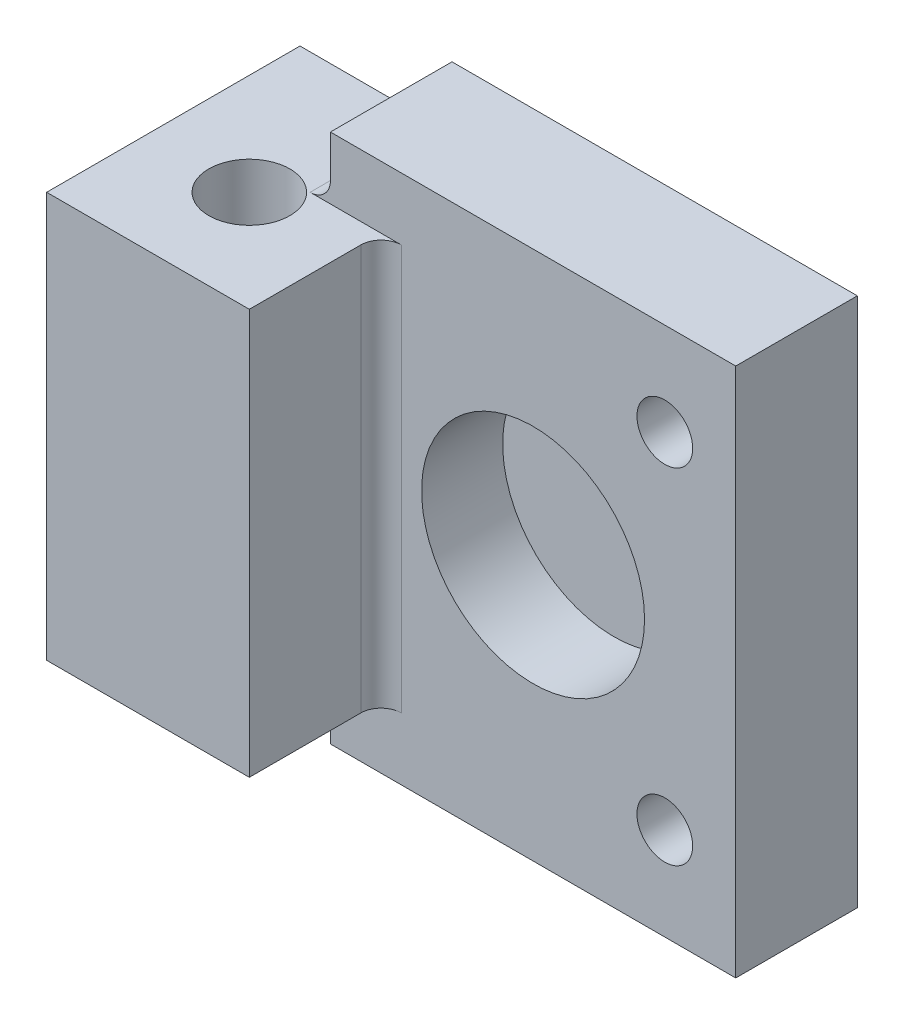
ISO-10303-21;
HEADER;
FILE_DESCRIPTION(('STEP AP214'),'2;1');
FILE_NAME('part.step','',(''),(''),'','','');
FILE_SCHEMA(('AUTOMOTIVE_DESIGN { 1 0 10303 214 1 1 1 1 }'));
ENDSEC;
DATA;
#1=APPLICATION_CONTEXT('core data for automotive mechanical design processes');
#2=APPLICATION_PROTOCOL_DEFINITION('international standard','automotive_design',2000,#1);
#3=PRODUCT_CONTEXT('',#1,'mechanical');
#4=PRODUCT('Part','Part','',(#3));
#5=PRODUCT_RELATED_PRODUCT_CATEGORY('part','',(#4));
#6=PRODUCT_DEFINITION_FORMATION('','',#4);
#7=PRODUCT_DEFINITION_CONTEXT('part definition',#1,'design');
#8=PRODUCT_DEFINITION('design','',#6,#7);
#9=PRODUCT_DEFINITION_SHAPE('','',#8);
#10=(LENGTH_UNIT() NAMED_UNIT(*) SI_UNIT(.MILLI.,.METRE.));
#11=(NAMED_UNIT(*) PLANE_ANGLE_UNIT() SI_UNIT($,.RADIAN.));
#12=(NAMED_UNIT(*) SI_UNIT($,.STERADIAN.) SOLID_ANGLE_UNIT());
#13=UNCERTAINTY_MEASURE_WITH_UNIT(LENGTH_MEASURE(1.E-05),#10,'distance_accuracy_value','');
#14=(GEOMETRIC_REPRESENTATION_CONTEXT(3) GLOBAL_UNCERTAINTY_ASSIGNED_CONTEXT((#13)) GLOBAL_UNIT_ASSIGNED_CONTEXT((#10,
#11,#12)) REPRESENTATION_CONTEXT('',''));
#15=CARTESIAN_POINT('',(0.,0.,0.));
#16=DIRECTION('',(0.,0.,1.));
#17=DIRECTION('',(1.,0.,0.));
#18=AXIS2_PLACEMENT_3D('',#15,#16,#17);
#19=CARTESIAN_POINT('',(0.,0.,12.));
#20=DIRECTION('',(0.,0.,-1.));
#21=DIRECTION('',(-1.,0.,0.));
#22=AXIS2_PLACEMENT_3D('',#19,#20,#21);
#23=PLANE('',#22);
#24=CARTESIAN_POINT('',(13.,-16.9975,12.));
#25=DIRECTION('',(0.,0.,1.));
#26=DIRECTION('',(1.,0.,0.));
#27=AXIS2_PLACEMENT_3D('',#24,#25,#26);
#28=CIRCLE('',#27,2.75);
#29=CARTESIAN_POINT('',(15.75,-16.9975,12.));
#30=VERTEX_POINT('',#29);
#31=EDGE_CURVE('E168',#30,#30,#28,.T.);
#32=ORIENTED_EDGE('',*,*,#31,.F.);
#33=EDGE_LOOP('',(#32));
#34=FACE_BOUND('',#33,.T.);
#35=CARTESIAN_POINT('',(13.,16.9975,12.));
#36=DIRECTION('',(0.,0.,1.));
#37=DIRECTION('',(1.,0.,0.));
#38=AXIS2_PLACEMENT_3D('',#35,#36,#37);
#39=CIRCLE('',#38,2.75);
#40=CARTESIAN_POINT('',(15.75,16.9975,12.));
#41=VERTEX_POINT('',#40);
#42=EDGE_CURVE('E174',#41,#41,#39,.T.);
#43=ORIENTED_EDGE('',*,*,#42,.F.);
#44=EDGE_LOOP('',(#43));
#45=FACE_BOUND('',#44,.T.);
#46=CARTESIAN_POINT('',(0.,0.,12.));
#47=DIRECTION('',(0.,0.,1.));
#48=DIRECTION('',(1.,0.,0.));
#49=AXIS2_PLACEMENT_3D('',#46,#47,#48);
#50=CIRCLE('',#49,11.);
#51=CARTESIAN_POINT('',(11.,0.,12.));
#52=VERTEX_POINT('',#51);
#53=EDGE_CURVE('E161',#52,#52,#50,.T.);
#54=ORIENTED_EDGE('',*,*,#53,.F.);
#55=EDGE_LOOP('',(#54));
#56=FACE_BOUND('',#55,.T.);
#57=DIRECTION('',(-1.,0.,0.));
#58=VECTOR('',#57,1.);
#59=CARTESIAN_POINT('',(0.,20.,12.));
#60=LINE('',#59,#58);
#61=CARTESIAN_POINT('',(-13.,20.,12.));
#62=VERTEX_POINT('',#61);
#63=CARTESIAN_POINT('',(-22.,20.,12.));
#64=VERTEX_POINT('',#63);
#65=EDGE_CURVE('E49',#62,#64,#60,.T.);
#66=ORIENTED_EDGE('',*,*,#65,.F.);
#67=DIRECTION('',(0.,1.,0.));
#68=VECTOR('',#67,1.);
#69=CARTESIAN_POINT('',(-13.,-20.,12.));
#70=LINE('',#69,#68);
#71=CARTESIAN_POINT('',(-13.,-20.,12.));
#72=VERTEX_POINT('',#71);
#73=EDGE_CURVE('E230',#62,#72,#70,.F.);
#74=ORIENTED_EDGE('',*,*,#73,.T.);
#75=DIRECTION('',(1.,0.,0.));
#76=VECTOR('',#75,1.);
#77=CARTESIAN_POINT('',(0.,-20.,12.));
#78=LINE('',#77,#76);
#79=CARTESIAN_POINT('',(-22.,-20.,12.));
#80=VERTEX_POINT('',#79);
#81=EDGE_CURVE('E56',#80,#72,#78,.T.);
#82=ORIENTED_EDGE('',*,*,#81,.F.);
#83=CARTESIAN_POINT('',(-22.,-22.,12.));
#84=DIRECTION('',(0.,0.,-1.));
#85=DIRECTION('',(-1.,0.,0.));
#86=AXIS2_PLACEMENT_3D('',#83,#84,#85);
#87=CIRCLE('',#86,2.);
#88=CARTESIAN_POINT('',(-20.,-22.,12.));
#89=VERTEX_POINT('',#88);
#90=EDGE_CURVE('E224',#80,#89,#87,.T.);
#91=ORIENTED_EDGE('',*,*,#90,.T.);
#92=DIRECTION('',(0.,-1.,0.));
#93=VECTOR('',#92,1.);
#94=CARTESIAN_POINT('',(-20.,26.15,12.));
#95=LINE('',#94,#93);
#96=CARTESIAN_POINT('',(-20.,-26.15,12.));
#97=VERTEX_POINT('',#96);
#98=EDGE_CURVE('E184',#89,#97,#95,.T.);
#99=ORIENTED_EDGE('',*,*,#98,.T.);
#100=DIRECTION('',(1.,0.,0.));
#101=VECTOR('',#100,1.);
#102=CARTESIAN_POINT('',(20.,-26.15,12.));
#103=LINE('',#102,#101);
#104=CARTESIAN_POINT('',(20.,-26.15,12.));
#105=VERTEX_POINT('',#104);
#106=EDGE_CURVE('E183',#97,#105,#103,.T.);
#107=ORIENTED_EDGE('',*,*,#106,.T.);
#108=DIRECTION('',(0.,1.,0.));
#109=VECTOR('',#108,1.);
#110=CARTESIAN_POINT('',(20.,26.15,12.));
#111=LINE('',#110,#109);
#112=CARTESIAN_POINT('',(20.,26.15,12.));
#113=VERTEX_POINT('',#112);
#114=EDGE_CURVE('E186',#105,#113,#111,.T.);
#115=ORIENTED_EDGE('',*,*,#114,.T.);
#116=DIRECTION('',(-1.,0.,0.));
#117=VECTOR('',#116,1.);
#118=CARTESIAN_POINT('',(20.,26.15,12.));
#119=LINE('',#118,#117);
#120=CARTESIAN_POINT('',(-20.,26.15,12.));
#121=VERTEX_POINT('',#120);
#122=EDGE_CURVE('E188',#113,#121,#119,.T.);
#123=ORIENTED_EDGE('',*,*,#122,.T.);
#124=CARTESIAN_POINT('',(-20.,22.,12.));
#125=VERTEX_POINT('',#124);
#126=EDGE_CURVE('E180',#121,#125,#95,.T.);
#127=ORIENTED_EDGE('',*,*,#126,.T.);
#128=CARTESIAN_POINT('',(-22.,22.,12.));
#129=DIRECTION('',(0.,0.,-1.));
#130=DIRECTION('',(-1.,0.,0.));
#131=AXIS2_PLACEMENT_3D('',#128,#129,#130);
#132=CIRCLE('',#131,2.);
#133=EDGE_CURVE('E222',#125,#64,#132,.T.);
#134=ORIENTED_EDGE('',*,*,#133,.T.);
#135=EDGE_LOOP('',(#66,#74,#82,#91,#99,#107,#115,#123,#127,#134));
#136=FACE_BOUND('',#135,.T.);
#137=ADVANCED_FACE('F34',(#34,#45,#56,#136),#23,.F.);
#138=CARTESIAN_POINT('',(-20.,26.15,12.));
#139=DIRECTION('',(1.,0.,0.));
#140=DIRECTION('',(0.,1.,0.));
#141=AXIS2_PLACEMENT_3D('',#138,#139,#140);
#142=PLANE('',#141);
#143=ORIENTED_EDGE('',*,*,#98,.F.);
#144=DIRECTION('',(0.,0.,1.));
#145=VECTOR('',#144,1.);
#146=CARTESIAN_POINT('',(-20.,-22.,0.));
#147=LINE('',#146,#145);
#148=CARTESIAN_POINT('',(-20.,-22.,0.));
#149=VERTEX_POINT('',#148);
#150=EDGE_CURVE('E218',#89,#149,#147,.F.);
#151=ORIENTED_EDGE('',*,*,#150,.T.);
#152=DIRECTION('',(0.,-1.,0.));
#153=VECTOR('',#152,1.);
#154=CARTESIAN_POINT('',(-20.,26.15,0.));
#155=LINE('',#154,#153);
#156=CARTESIAN_POINT('',(-20.,-26.15,0.));
#157=VERTEX_POINT('',#156);
#158=EDGE_CURVE('E177',#149,#157,#155,.T.);
#159=ORIENTED_EDGE('',*,*,#158,.T.);
#160=DIRECTION('',(0.,0.,-1.));
#161=VECTOR('',#160,1.);
#162=CARTESIAN_POINT('',(-20.,-26.15,12.));
#163=LINE('',#162,#161);
#164=EDGE_CURVE('E208',#97,#157,#163,.T.);
#165=ORIENTED_EDGE('',*,*,#164,.F.);
#166=EDGE_LOOP('',(#143,#151,#159,#165));
#167=FACE_BOUND('',#166,.T.);
#168=ADVANCED_FACE('F246',(#167),#142,.F.);
#169=CARTESIAN_POINT('',(-20.,26.15,0.));
#170=VERTEX_POINT('',#169);
#171=CARTESIAN_POINT('',(-20.,22.,0.));
#172=VERTEX_POINT('',#171);
#173=EDGE_CURVE('E191',#170,#172,#155,.T.);
#174=ORIENTED_EDGE('',*,*,#173,.T.);
#175=DIRECTION('',(0.,0.,-1.));
#176=VECTOR('',#175,1.);
#177=CARTESIAN_POINT('',(-20.,22.,12.));
#178=LINE('',#177,#176);
#179=EDGE_CURVE('E214',#172,#125,#178,.F.);
#180=ORIENTED_EDGE('',*,*,#179,.T.);
#181=ORIENTED_EDGE('',*,*,#126,.F.);
#182=DIRECTION('',(0.,0.,-1.));
#183=VECTOR('',#182,1.);
#184=CARTESIAN_POINT('',(-20.,26.15,12.));
#185=LINE('',#184,#183);
#186=EDGE_CURVE('E190',#121,#170,#185,.T.);
#187=ORIENTED_EDGE('',*,*,#186,.T.);
#188=EDGE_LOOP('',(#174,#180,#181,#187));
#189=FACE_BOUND('',#188,.T.);
#190=ADVANCED_FACE('F266',(#189),#142,.F.);
#191=CARTESIAN_POINT('',(0.,0.,0.));
#192=DIRECTION('',(0.,0.,-1.));
#193=DIRECTION('',(-1.,0.,0.));
#194=AXIS2_PLACEMENT_3D('',#191,#192,#193);
#195=PLANE('',#194);
#196=DIRECTION('',(1.,0.,0.));
#197=VECTOR('',#196,1.);
#198=CARTESIAN_POINT('',(-35.,20.,0.));
#199=LINE('',#198,#197);
#200=CARTESIAN_POINT('',(-35.,20.,0.));
#201=VERTEX_POINT('',#200);
#202=CARTESIAN_POINT('',(-22.,20.,0.));
#203=VERTEX_POINT('',#202);
#204=EDGE_CURVE('E272',#201,#203,#199,.T.);
#205=ORIENTED_EDGE('',*,*,#204,.T.);
#206=CARTESIAN_POINT('',(-22.,22.,0.));
#207=DIRECTION('',(0.,0.,-1.));
#208=DIRECTION('',(-1.,0.,0.));
#209=AXIS2_PLACEMENT_3D('',#206,#207,#208);
#210=CIRCLE('',#209,2.);
#211=EDGE_CURVE('E220',#203,#172,#210,.F.);
#212=ORIENTED_EDGE('',*,*,#211,.T.);
#213=ORIENTED_EDGE('',*,*,#173,.F.);
#214=DIRECTION('',(-1.,0.,0.));
#215=VECTOR('',#214,1.);
#216=CARTESIAN_POINT('',(20.,26.15,0.));
#217=LINE('',#216,#215);
#218=CARTESIAN_POINT('',(20.,26.15,0.));
#219=VERTEX_POINT('',#218);
#220=EDGE_CURVE('E198',#219,#170,#217,.T.);
#221=ORIENTED_EDGE('',*,*,#220,.F.);
#222=DIRECTION('',(0.,1.,0.));
#223=VECTOR('',#222,1.);
#224=CARTESIAN_POINT('',(20.,26.15,0.));
#225=LINE('',#224,#223);
#226=CARTESIAN_POINT('',(20.,-26.15,0.));
#227=VERTEX_POINT('',#226);
#228=EDGE_CURVE('E196',#227,#219,#225,.T.);
#229=ORIENTED_EDGE('',*,*,#228,.F.);
#230=DIRECTION('',(1.,0.,0.));
#231=VECTOR('',#230,1.);
#232=CARTESIAN_POINT('',(20.,-26.15,0.));
#233=LINE('',#232,#231);
#234=EDGE_CURVE('E194',#157,#227,#233,.T.);
#235=ORIENTED_EDGE('',*,*,#234,.F.);
#236=ORIENTED_EDGE('',*,*,#158,.F.);
#237=CARTESIAN_POINT('',(-22.,-22.,0.));
#238=DIRECTION('',(0.,0.,-1.));
#239=DIRECTION('',(-1.,0.,0.));
#240=AXIS2_PLACEMENT_3D('',#237,#238,#239);
#241=CIRCLE('',#240,2.);
#242=CARTESIAN_POINT('',(-22.,-20.,0.));
#243=VERTEX_POINT('',#242);
#244=EDGE_CURVE('E153',#149,#243,#241,.F.);
#245=ORIENTED_EDGE('',*,*,#244,.T.);
#246=DIRECTION('',(1.,0.,0.));
#247=VECTOR('',#246,1.);
#248=CARTESIAN_POINT('',(-35.,-20.,0.));
#249=LINE('',#248,#247);
#250=CARTESIAN_POINT('',(-35.,-20.,0.));
#251=VERTEX_POINT('',#250);
#252=EDGE_CURVE('E131',#251,#243,#249,.T.);
#253=ORIENTED_EDGE('',*,*,#252,.F.);
#254=DIRECTION('',(0.,-1.,0.));
#255=VECTOR('',#254,1.);
#256=CARTESIAN_POINT('',(-35.,20.,0.));
#257=LINE('',#256,#255);
#258=EDGE_CURVE('E138',#201,#251,#257,.T.);
#259=ORIENTED_EDGE('',*,*,#258,.F.);
#260=EDGE_LOOP('',(#205,#212,#213,#221,#229,#235,#236,#245,#253,#259));
#261=FACE_BOUND('',#260,.T.);
#262=CARTESIAN_POINT('',(13.,16.9975,0.));
#263=DIRECTION('',(0.,0.,1.));
#264=DIRECTION('',(1.,0.,0.));
#265=AXIS2_PLACEMENT_3D('',#262,#263,#264);
#266=CIRCLE('',#265,2.75);
#267=CARTESIAN_POINT('',(15.75,16.9975,0.));
#268=VERTEX_POINT('',#267);
#269=EDGE_CURVE('E171',#268,#268,#266,.T.);
#270=ORIENTED_EDGE('',*,*,#269,.T.);
#271=EDGE_LOOP('',(#270));
#272=FACE_BOUND('',#271,.T.);
#273=CARTESIAN_POINT('',(13.,-16.9975,0.));
#274=DIRECTION('',(0.,0.,1.));
#275=DIRECTION('',(1.,0.,0.));
#276=AXIS2_PLACEMENT_3D('',#273,#274,#275);
#277=CIRCLE('',#276,2.75);
#278=CARTESIAN_POINT('',(15.75,-16.9975,0.));
#279=VERTEX_POINT('',#278);
#280=EDGE_CURVE('E165',#279,#279,#277,.T.);
#281=ORIENTED_EDGE('',*,*,#280,.T.);
#282=EDGE_LOOP('',(#281));
#283=FACE_BOUND('',#282,.T.);
#284=ADVANCED_FACE('F149',(#261,#272,#283),#195,.T.);
#285=CARTESIAN_POINT('',(20.,-26.15,12.));
#286=DIRECTION('',(0.,1.,0.));
#287=DIRECTION('',(0.,0.,1.));
#288=AXIS2_PLACEMENT_3D('',#285,#286,#287);
#289=PLANE('',#288);
#290=ORIENTED_EDGE('',*,*,#234,.T.);
#291=DIRECTION('',(0.,0.,-1.));
#292=VECTOR('',#291,1.);
#293=CARTESIAN_POINT('',(20.,-26.15,12.));
#294=LINE('',#293,#292);
#295=EDGE_CURVE('E205',#105,#227,#294,.T.);
#296=ORIENTED_EDGE('',*,*,#295,.F.);
#297=ORIENTED_EDGE('',*,*,#106,.F.);
#298=ORIENTED_EDGE('',*,*,#164,.T.);
#299=EDGE_LOOP('',(#290,#296,#297,#298));
#300=FACE_BOUND('',#299,.T.);
#301=ADVANCED_FACE('F254',(#300),#289,.F.);
#302=CARTESIAN_POINT('',(20.,26.15,12.));
#303=DIRECTION('',(-1.,0.,0.));
#304=DIRECTION('',(0.,-1.,0.));
#305=AXIS2_PLACEMENT_3D('',#302,#303,#304);
#306=PLANE('',#305);
#307=ORIENTED_EDGE('',*,*,#228,.T.);
#308=DIRECTION('',(0.,0.,-1.));
#309=VECTOR('',#308,1.);
#310=CARTESIAN_POINT('',(20.,26.15,12.));
#311=LINE('',#310,#309);
#312=EDGE_CURVE('E202',#113,#219,#311,.T.);
#313=ORIENTED_EDGE('',*,*,#312,.F.);
#314=ORIENTED_EDGE('',*,*,#114,.F.);
#315=ORIENTED_EDGE('',*,*,#295,.T.);
#316=EDGE_LOOP('',(#307,#313,#314,#315));
#317=FACE_BOUND('',#316,.T.);
#318=ADVANCED_FACE('F260',(#317),#306,.F.);
#319=CARTESIAN_POINT('',(20.,26.15,12.));
#320=DIRECTION('',(0.,-1.,0.));
#321=DIRECTION('',(1.,0.,0.));
#322=AXIS2_PLACEMENT_3D('',#319,#320,#321);
#323=PLANE('',#322);
#324=ORIENTED_EDGE('',*,*,#220,.T.);
#325=ORIENTED_EDGE('',*,*,#186,.F.);
#326=ORIENTED_EDGE('',*,*,#122,.F.);
#327=ORIENTED_EDGE('',*,*,#312,.T.);
#328=EDGE_LOOP('',(#324,#325,#326,#327));
#329=FACE_BOUND('',#328,.T.);
#330=ADVANCED_FACE('F262',(#329),#323,.F.);
#331=CARTESIAN_POINT('',(13.,16.9975,12.));
#332=DIRECTION('',(0.,0.,-1.));
#333=DIRECTION('',(-1.,0.,0.));
#334=AXIS2_PLACEMENT_3D('',#331,#332,#333);
#335=CYLINDRICAL_SURFACE('',#334,2.75);
#336=ORIENTED_EDGE('',*,*,#42,.T.);
#337=EDGE_LOOP('',(#336));
#338=FACE_BOUND('',#337,.T.);
#339=ORIENTED_EDGE('',*,*,#269,.F.);
#340=EDGE_LOOP('',(#339));
#341=FACE_BOUND('',#340,.T.);
#342=ADVANCED_FACE('F320',(#338,#341),#335,.F.);
#343=CARTESIAN_POINT('',(13.,-16.9975,12.));
#344=DIRECTION('',(0.,0.,-1.));
#345=DIRECTION('',(-1.,0.,0.));
#346=AXIS2_PLACEMENT_3D('',#343,#344,#345);
#347=CYLINDRICAL_SURFACE('',#346,2.75);
#348=ORIENTED_EDGE('',*,*,#31,.T.);
#349=EDGE_LOOP('',(#348));
#350=FACE_BOUND('',#349,.T.);
#351=ORIENTED_EDGE('',*,*,#280,.F.);
#352=EDGE_LOOP('',(#351));
#353=FACE_BOUND('',#352,.T.);
#354=ADVANCED_FACE('F437',(#350,#353),#347,.F.);
#355=CARTESIAN_POINT('',(0.,0.,4.));
#356=DIRECTION('',(0.,0.,1.));
#357=DIRECTION('',(1.,0.,0.));
#358=AXIS2_PLACEMENT_3D('',#355,#356,#357);
#359=CYLINDRICAL_SURFACE('',#358,11.);
#360=CARTESIAN_POINT('',(0.,0.,4.));
#361=DIRECTION('',(0.,0.,1.));
#362=DIRECTION('',(1.,0.,0.));
#363=AXIS2_PLACEMENT_3D('',#360,#361,#362);
#364=CIRCLE('',#363,11.);
#365=CARTESIAN_POINT('',(11.,0.,4.));
#366=VERTEX_POINT('',#365);
#367=EDGE_CURVE('E162',#366,#366,#364,.T.);
#368=ORIENTED_EDGE('',*,*,#367,.F.);
#369=EDGE_LOOP('',(#368));
#370=FACE_BOUND('',#369,.T.);
#371=ORIENTED_EDGE('',*,*,#53,.T.);
#372=EDGE_LOOP('',(#371));
#373=FACE_BOUND('',#372,.T.);
#374=ADVANCED_FACE('F427',(#370,#373),#359,.F.);
#375=CARTESIAN_POINT('',(0.,0.,4.));
#376=DIRECTION('',(0.,0.,1.));
#377=DIRECTION('',(1.,0.,0.));
#378=AXIS2_PLACEMENT_3D('',#375,#376,#377);
#379=PLANE('',#378);
#380=ORIENTED_EDGE('',*,*,#367,.T.);
#381=EDGE_LOOP('',(#380));
#382=FACE_BOUND('',#381,.T.);
#383=ADVANCED_FACE('F357',(#382),#379,.T.);
#384=CARTESIAN_POINT('',(-15.,0.,0.));
#385=DIRECTION('',(-1.,0.,0.));
#386=DIRECTION('',(0.,-1.,0.));
#387=AXIS2_PLACEMENT_3D('',#384,#385,#386);
#388=PLANE('',#387);
#389=DIRECTION('',(0.,0.,1.));
#390=VECTOR('',#389,1.);
#391=CARTESIAN_POINT('',(-15.,-20.,0.));
#392=LINE('',#391,#390);
#393=CARTESIAN_POINT('',(-15.,-20.,14.));
#394=VERTEX_POINT('',#393);
#395=CARTESIAN_POINT('',(-15.,-20.,25.));
#396=VERTEX_POINT('',#395);
#397=EDGE_CURVE('E279',#394,#396,#392,.T.);
#398=ORIENTED_EDGE('',*,*,#397,.F.);
#399=DIRECTION('',(0.,1.,0.));
#400=VECTOR('',#399,1.);
#401=CARTESIAN_POINT('',(-15.,20.,14.));
#402=LINE('',#401,#400);
#403=CARTESIAN_POINT('',(-15.,20.,14.));
#404=VERTEX_POINT('',#403);
#405=EDGE_CURVE('E227',#394,#404,#402,.T.);
#406=ORIENTED_EDGE('',*,*,#405,.T.);
#407=DIRECTION('',(0.,0.,-1.));
#408=VECTOR('',#407,1.);
#409=CARTESIAN_POINT('',(-15.,20.,0.));
#410=LINE('',#409,#408);
#411=CARTESIAN_POINT('',(-15.,20.,25.));
#412=VERTEX_POINT('',#411);
#413=EDGE_CURVE('E147',#412,#404,#410,.T.);
#414=ORIENTED_EDGE('',*,*,#413,.F.);
#415=DIRECTION('',(0.,1.,0.));
#416=VECTOR('',#415,1.);
#417=CARTESIAN_POINT('',(-15.,20.,25.));
#418=LINE('',#417,#416);
#419=EDGE_CURVE('E277',#396,#412,#418,.T.);
#420=ORIENTED_EDGE('',*,*,#419,.F.);
#421=EDGE_LOOP('',(#398,#406,#414,#420));
#422=FACE_BOUND('',#421,.T.);
#423=ADVANCED_FACE('F306',(#422),#388,.F.);
#424=CARTESIAN_POINT('',(-35.,-20.,0.));
#425=DIRECTION('',(0.,1.,0.));
#426=DIRECTION('',(-1.,0.,0.));
#427=AXIS2_PLACEMENT_3D('',#424,#425,#426);
#428=PLANE('',#427);
#429=ORIENTED_EDGE('',*,*,#252,.T.);
#430=DIRECTION('',(0.,0.,1.));
#431=VECTOR('',#430,1.);
#432=CARTESIAN_POINT('',(-22.,-20.,12.));
#433=LINE('',#432,#431);
#434=EDGE_CURVE('E216',#243,#80,#433,.T.);
#435=ORIENTED_EDGE('',*,*,#434,.T.);
#436=ORIENTED_EDGE('',*,*,#81,.T.);
#437=CARTESIAN_POINT('',(-13.,-20.,14.));
#438=DIRECTION('',(0.,1.,0.));
#439=DIRECTION('',(-1.,0.,0.));
#440=AXIS2_PLACEMENT_3D('',#437,#438,#439);
#441=CIRCLE('',#440,2.);
#442=EDGE_CURVE('E11',#72,#394,#441,.T.);
#443=ORIENTED_EDGE('',*,*,#442,.T.);
#444=ORIENTED_EDGE('',*,*,#397,.T.);
#445=DIRECTION('',(1.,0.,0.));
#446=VECTOR('',#445,1.);
#447=CARTESIAN_POINT('',(-35.,-20.,25.));
#448=LINE('',#447,#446);
#449=CARTESIAN_POINT('',(-35.,-20.,25.));
#450=VERTEX_POINT('',#449);
#451=EDGE_CURVE('E134',#450,#396,#448,.T.);
#452=ORIENTED_EDGE('',*,*,#451,.F.);
#453=DIRECTION('',(0.,0.,1.));
#454=VECTOR('',#453,1.);
#455=CARTESIAN_POINT('',(-35.,-20.,0.));
#456=LINE('',#455,#454);
#457=EDGE_CURVE('E127',#251,#450,#456,.T.);
#458=ORIENTED_EDGE('',*,*,#457,.F.);
#459=EDGE_LOOP('',(#429,#435,#436,#443,#444,#452,#458));
#460=FACE_BOUND('',#459,.T.);
#461=ADVANCED_FACE('F129',(#460),#428,.F.);
#462=CARTESIAN_POINT('',(-35.,20.,0.));
#463=DIRECTION('',(0.,-1.,0.));
#464=DIRECTION('',(1.,0.,0.));
#465=AXIS2_PLACEMENT_3D('',#462,#463,#464);
#466=PLANE('',#465);
#467=CARTESIAN_POINT('',(-25.,20.,15.));
#468=DIRECTION('',(0.,1.,0.));
#469=DIRECTION('',(-1.,0.,0.));
#470=AXIS2_PLACEMENT_3D('',#467,#468,#469);
#471=CIRCLE('',#470,4.);
#472=CARTESIAN_POINT('',(-29.,20.,15.));
#473=VERTEX_POINT('',#472);
#474=EDGE_CURVE('E283',#473,#473,#471,.T.);
#475=ORIENTED_EDGE('',*,*,#474,.F.);
#476=EDGE_LOOP('',(#475));
#477=FACE_BOUND('',#476,.T.);
#478=ORIENTED_EDGE('',*,*,#65,.T.);
#479=DIRECTION('',(0.,0.,-1.));
#480=VECTOR('',#479,1.);
#481=CARTESIAN_POINT('',(-22.,20.,0.));
#482=LINE('',#481,#480);
#483=EDGE_CURVE('E211',#64,#203,#482,.T.);
#484=ORIENTED_EDGE('',*,*,#483,.T.);
#485=ORIENTED_EDGE('',*,*,#204,.F.);
#486=DIRECTION('',(0.,0.,-1.));
#487=VECTOR('',#486,1.);
#488=CARTESIAN_POINT('',(-35.,20.,0.));
#489=LINE('',#488,#487);
#490=CARTESIAN_POINT('',(-35.,20.,25.));
#491=VERTEX_POINT('',#490);
#492=EDGE_CURVE('E143',#491,#201,#489,.T.);
#493=ORIENTED_EDGE('',*,*,#492,.F.);
#494=DIRECTION('',(1.,0.,0.));
#495=VECTOR('',#494,1.);
#496=CARTESIAN_POINT('',(-35.,20.,25.));
#497=LINE('',#496,#495);
#498=EDGE_CURVE('E156',#491,#412,#497,.T.);
#499=ORIENTED_EDGE('',*,*,#498,.T.);
#500=ORIENTED_EDGE('',*,*,#413,.T.);
#501=CARTESIAN_POINT('',(-13.,20.,14.));
#502=DIRECTION('',(0.,-1.,0.));
#503=DIRECTION('',(1.,0.,0.));
#504=AXIS2_PLACEMENT_3D('',#501,#502,#503);
#505=CIRCLE('',#504,2.);
#506=EDGE_CURVE('E42',#404,#62,#505,.T.);
#507=ORIENTED_EDGE('',*,*,#506,.T.);
#508=EDGE_LOOP('',(#478,#484,#485,#493,#499,#500,#507));
#509=FACE_BOUND('',#508,.T.);
#510=ADVANCED_FACE('F234',(#477,#509),#466,.F.);
#511=CARTESIAN_POINT('',(-35.,20.,25.));
#512=DIRECTION('',(0.,0.,-1.));
#513=DIRECTION('',(-1.,0.,0.));
#514=AXIS2_PLACEMENT_3D('',#511,#512,#513);
#515=PLANE('',#514);
#516=ORIENTED_EDGE('',*,*,#419,.T.);
#517=ORIENTED_EDGE('',*,*,#498,.F.);
#518=DIRECTION('',(0.,1.,0.));
#519=VECTOR('',#518,1.);
#520=CARTESIAN_POINT('',(-35.,20.,25.));
#521=LINE('',#520,#519);
#522=EDGE_CURVE('E137',#450,#491,#521,.T.);
#523=ORIENTED_EDGE('',*,*,#522,.F.);
#524=ORIENTED_EDGE('',*,*,#451,.T.);
#525=EDGE_LOOP('',(#516,#517,#523,#524));
#526=FACE_BOUND('',#525,.T.);
#527=ADVANCED_FACE('F298',(#526),#515,.F.);
#528=CARTESIAN_POINT('',(-35.,0.,0.));
#529=DIRECTION('',(-1.,0.,0.));
#530=DIRECTION('',(0.,-1.,0.));
#531=AXIS2_PLACEMENT_3D('',#528,#529,#530);
#532=PLANE('',#531);
#533=ORIENTED_EDGE('',*,*,#258,.T.);
#534=ORIENTED_EDGE('',*,*,#457,.T.);
#535=ORIENTED_EDGE('',*,*,#522,.T.);
#536=ORIENTED_EDGE('',*,*,#492,.T.);
#537=EDGE_LOOP('',(#533,#534,#535,#536));
#538=FACE_BOUND('',#537,.T.);
#539=ADVANCED_FACE('F141',(#538),#532,.T.);
#540=CARTESIAN_POINT('',(-25.,-15.,15.));
#541=DIRECTION('',(0.,1.,0.));
#542=DIRECTION('',(-1.,0.,0.));
#543=AXIS2_PLACEMENT_3D('',#540,#541,#542);
#544=CYLINDRICAL_SURFACE('',#543,4.);
#545=CARTESIAN_POINT('',(-25.,-15.,15.));
#546=DIRECTION('',(0.,1.,0.));
#547=DIRECTION('',(-1.,0.,0.));
#548=AXIS2_PLACEMENT_3D('',#545,#546,#547);
#549=CIRCLE('',#548,4.);
#550=CARTESIAN_POINT('',(-29.,-15.,15.));
#551=VERTEX_POINT('',#550);
#552=EDGE_CURVE('E280',#551,#551,#549,.T.);
#553=ORIENTED_EDGE('',*,*,#552,.F.);
#554=EDGE_LOOP('',(#553));
#555=FACE_BOUND('',#554,.T.);
#556=ORIENTED_EDGE('',*,*,#474,.T.);
#557=EDGE_LOOP('',(#556));
#558=FACE_BOUND('',#557,.T.);
#559=ADVANCED_FACE('F291',(#555,#558),#544,.F.);
#560=CARTESIAN_POINT('',(-25.,-15.,15.));
#561=DIRECTION('',(0.,1.,0.));
#562=DIRECTION('',(-1.,0.,0.));
#563=AXIS2_PLACEMENT_3D('',#560,#561,#562);
#564=PLANE('',#563);
#565=ORIENTED_EDGE('',*,*,#552,.T.);
#566=EDGE_LOOP('',(#565));
#567=FACE_BOUND('',#566,.T.);
#568=ADVANCED_FACE('F289',(#567),#564,.T.);
#569=CARTESIAN_POINT('',(-22.,22.,0.));
#570=DIRECTION('',(0.,0.,1.));
#571=DIRECTION('',(1.,0.,0.));
#572=AXIS2_PLACEMENT_3D('',#569,#570,#571);
#573=CYLINDRICAL_SURFACE('',#572,2.);
#574=ORIENTED_EDGE('',*,*,#133,.F.);
#575=ORIENTED_EDGE('',*,*,#179,.F.);
#576=ORIENTED_EDGE('',*,*,#211,.F.);
#577=ORIENTED_EDGE('',*,*,#483,.F.);
#578=EDGE_LOOP('',(#574,#575,#576,#577));
#579=FACE_BOUND('',#578,.T.);
#580=ADVANCED_FACE('F271',(#579),#573,.F.);
#581=CARTESIAN_POINT('',(-22.,-22.,0.));
#582=DIRECTION('',(0.,0.,-1.));
#583=DIRECTION('',(-1.,0.,0.));
#584=AXIS2_PLACEMENT_3D('',#581,#582,#583);
#585=CYLINDRICAL_SURFACE('',#584,2.);
#586=ORIENTED_EDGE('',*,*,#244,.F.);
#587=ORIENTED_EDGE('',*,*,#150,.F.);
#588=ORIENTED_EDGE('',*,*,#90,.F.);
#589=ORIENTED_EDGE('',*,*,#434,.F.);
#590=EDGE_LOOP('',(#586,#587,#588,#589));
#591=FACE_BOUND('',#590,.T.);
#592=ADVANCED_FACE('F244',(#591),#585,.F.);
#593=CARTESIAN_POINT('',(-13.,0.,14.));
#594=DIRECTION('',(0.,-1.,0.));
#595=DIRECTION('',(1.,0.,0.));
#596=AXIS2_PLACEMENT_3D('',#593,#594,#595);
#597=CYLINDRICAL_SURFACE('',#596,2.);
#598=ORIENTED_EDGE('',*,*,#442,.F.);
#599=ORIENTED_EDGE('',*,*,#73,.F.);
#600=ORIENTED_EDGE('',*,*,#506,.F.);
#601=ORIENTED_EDGE('',*,*,#405,.F.);
#602=EDGE_LOOP('',(#598,#599,#600,#601));
#603=FACE_BOUND('',#602,.T.);
#604=ADVANCED_FACE('F36',(#603),#597,.F.);
#605=CLOSED_SHELL('',(#137,#168,#190,#284,#301,#318,#330,#342,#354,#374,#383,#423,#461,#510,
#527,#539,#559,#568,#580,#592,#604));
#606=MANIFOLD_SOLID_BREP('B2',#605);
#607=ADVANCED_BREP_SHAPE_REPRESENTATION('',(#18,#606),#14);
#608=SHAPE_DEFINITION_REPRESENTATION(#9,#607);
ENDSEC;
END-ISO-10303-21;
